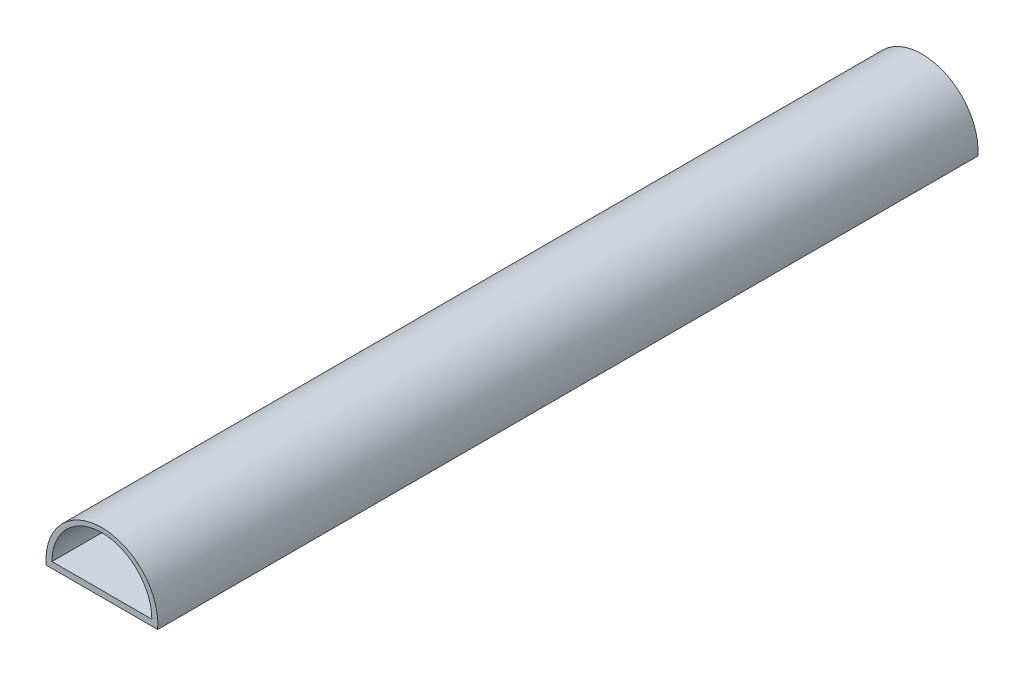
ISO-10303-21;
HEADER;
FILE_DESCRIPTION(('STEP AP214'),'2;1');
FILE_NAME('part.step','',(''),(''),'','','');
FILE_SCHEMA(('AUTOMOTIVE_DESIGN { 1 0 10303 214 1 1 1 1 }'));
ENDSEC;
DATA;
#1=APPLICATION_CONTEXT('core data for automotive mechanical design processes');
#2=APPLICATION_PROTOCOL_DEFINITION('international standard','automotive_design',2000,#1);
#3=PRODUCT_CONTEXT('',#1,'mechanical');
#4=PRODUCT('Part','Part','',(#3));
#5=PRODUCT_RELATED_PRODUCT_CATEGORY('part','',(#4));
#6=PRODUCT_DEFINITION_FORMATION('','',#4);
#7=PRODUCT_DEFINITION_CONTEXT('part definition',#1,'design');
#8=PRODUCT_DEFINITION('design','',#6,#7);
#9=PRODUCT_DEFINITION_SHAPE('','',#8);
#10=(LENGTH_UNIT() NAMED_UNIT(*) SI_UNIT(.MILLI.,.METRE.));
#11=(NAMED_UNIT(*) PLANE_ANGLE_UNIT() SI_UNIT($,.RADIAN.));
#12=(NAMED_UNIT(*) SI_UNIT($,.STERADIAN.) SOLID_ANGLE_UNIT());
#13=UNCERTAINTY_MEASURE_WITH_UNIT(LENGTH_MEASURE(1.E-05),#10,'distance_accuracy_value','');
#14=(GEOMETRIC_REPRESENTATION_CONTEXT(3) GLOBAL_UNCERTAINTY_ASSIGNED_CONTEXT((#13)) GLOBAL_UNIT_ASSIGNED_CONTEXT((#10,
#11,#12)) REPRESENTATION_CONTEXT('',''));
#15=CARTESIAN_POINT('',(0.,0.,0.));
#16=DIRECTION('',(0.,0.,1.));
#17=DIRECTION('',(1.,0.,0.));
#18=AXIS2_PLACEMENT_3D('',#15,#16,#17);
#19=CARTESIAN_POINT('',(-8.42700279293845,-8.87685553456328,215.9));
#20=DIRECTION('',(0.,0.,-1.));
#21=DIRECTION('',(-1.,0.,0.));
#22=AXIS2_PLACEMENT_3D('',#19,#20,#21);
#23=PLANE('',#22);
#24=CARTESIAN_POINT('',(-8.42700279293845,-8.87685553456328,215.9));
#25=DIRECTION('',(0.,0.,1.));
#26=DIRECTION('',(-1.,0.,0.));
#27=AXIS2_PLACEMENT_3D('',#24,#25,#26);
#28=CIRCLE('',#27,14.7310367744908);
#29=CARTESIAN_POINT('',(6.25737220706155,-10.0484251273645,215.9));
#30=VERTEX_POINT('',#29);
#31=CARTESIAN_POINT('',(-23.1113777929385,-10.0484251273645,215.9));
#32=VERTEX_POINT('',#31);
#33=EDGE_CURVE('E103',#30,#32,#28,.T.);
#34=ORIENTED_EDGE('',*,*,#33,.T.);
#35=DIRECTION('',(1.,0.,0.));
#36=VECTOR('',#35,1.);
#37=CARTESIAN_POINT('',(-23.1113777929385,-10.0484251273645,215.9));
#38=LINE('',#37,#36);
#39=EDGE_CURVE('E107',#32,#30,#38,.T.);
#40=ORIENTED_EDGE('',*,*,#39,.T.);
#41=EDGE_LOOP('',(#34,#40));
#42=FACE_BOUND('',#41,.T.);
#43=CARTESIAN_POINT('',(-8.42700279293845,-8.46092512736455,215.9));
#44=DIRECTION('',(0.,0.,1.));
#45=DIRECTION('',(-1.,0.,0.));
#46=AXIS2_PLACEMENT_3D('',#43,#44,#45);
#47=CIRCLE('',#46,13.1445);
#48=CARTESIAN_POINT('',(4.71749720706154,-8.46092512736455,215.9));
#49=VERTEX_POINT('',#48);
#50=CARTESIAN_POINT('',(-21.5715027929384,-8.46092512736455,215.9));
#51=VERTEX_POINT('',#50);
#52=EDGE_CURVE('E83',#49,#51,#47,.T.);
#53=ORIENTED_EDGE('',*,*,#52,.F.);
#54=DIRECTION('',(1.,0.,0.));
#55=VECTOR('',#54,1.);
#56=CARTESIAN_POINT('',(-8.42700279293845,-8.46092512736455,215.9));
#57=LINE('',#56,#55);
#58=EDGE_CURVE('E78',#51,#49,#57,.T.);
#59=ORIENTED_EDGE('',*,*,#58,.F.);
#60=EDGE_LOOP('',(#53,#59));
#61=FACE_BOUND('',#60,.T.);
#62=ADVANCED_FACE('F39',(#42,#61),#23,.F.);
#63=CARTESIAN_POINT('',(-8.42700279293845,-8.87685553456328,0.));
#64=DIRECTION('',(0.,0.,-1.));
#65=DIRECTION('',(-1.,0.,0.));
#66=AXIS2_PLACEMENT_3D('',#63,#64,#65);
#67=PLANE('',#66);
#68=CARTESIAN_POINT('',(-8.42700279293845,-8.87685553456328,0.));
#69=DIRECTION('',(0.,0.,1.));
#70=DIRECTION('',(-1.,0.,0.));
#71=AXIS2_PLACEMENT_3D('',#68,#69,#70);
#72=CIRCLE('',#71,14.7310367744908);
#73=CARTESIAN_POINT('',(6.25737220706155,-10.0484251273645,0.));
#74=VERTEX_POINT('',#73);
#75=CARTESIAN_POINT('',(-23.1113777929385,-10.0484251273645,0.));
#76=VERTEX_POINT('',#75);
#77=EDGE_CURVE('E92',#74,#76,#72,.T.);
#78=ORIENTED_EDGE('',*,*,#77,.F.);
#79=DIRECTION('',(1.,0.,0.));
#80=VECTOR('',#79,1.);
#81=CARTESIAN_POINT('',(-23.1113777929385,-10.0484251273645,0.));
#82=LINE('',#81,#80);
#83=EDGE_CURVE('E108',#76,#74,#82,.T.);
#84=ORIENTED_EDGE('',*,*,#83,.F.);
#85=EDGE_LOOP('',(#78,#84));
#86=FACE_BOUND('',#85,.T.);
#87=DIRECTION('',(1.,0.,0.));
#88=VECTOR('',#87,1.);
#89=CARTESIAN_POINT('',(-8.42700279293845,-8.46092512736455,0.));
#90=LINE('',#89,#88);
#91=CARTESIAN_POINT('',(-21.5715027929384,-8.46092512736455,0.));
#92=VERTEX_POINT('',#91);
#93=CARTESIAN_POINT('',(4.71749720706154,-8.46092512736455,0.));
#94=VERTEX_POINT('',#93);
#95=EDGE_CURVE('E84',#92,#94,#90,.T.);
#96=ORIENTED_EDGE('',*,*,#95,.T.);
#97=CARTESIAN_POINT('',(-8.42700279293845,-8.46092512736455,0.));
#98=DIRECTION('',(0.,0.,1.));
#99=DIRECTION('',(-1.,0.,0.));
#100=AXIS2_PLACEMENT_3D('',#97,#98,#99);
#101=CIRCLE('',#100,13.1445);
#102=EDGE_CURVE('E89',#94,#92,#101,.T.);
#103=ORIENTED_EDGE('',*,*,#102,.T.);
#104=EDGE_LOOP('',(#96,#103));
#105=FACE_BOUND('',#104,.T.);
#106=ADVANCED_FACE('F124',(#86,#105),#67,.T.);
#107=CARTESIAN_POINT('',(-8.42700279293845,-8.87685553456328,215.9));
#108=DIRECTION('',(0.,0.,-1.));
#109=DIRECTION('',(-1.,0.,0.));
#110=AXIS2_PLACEMENT_3D('',#107,#108,#109);
#111=CYLINDRICAL_SURFACE('',#110,14.7310367744908);
#112=ORIENTED_EDGE('',*,*,#77,.T.);
#113=DIRECTION('',(0.,0.,-1.));
#114=VECTOR('',#113,1.);
#115=CARTESIAN_POINT('',(-23.1113777929385,-10.0484251273645,215.9));
#116=LINE('',#115,#114);
#117=EDGE_CURVE('E11',#32,#76,#116,.T.);
#118=ORIENTED_EDGE('',*,*,#117,.F.);
#119=ORIENTED_EDGE('',*,*,#33,.F.);
#120=DIRECTION('',(0.,0.,-1.));
#121=VECTOR('',#120,1.);
#122=CARTESIAN_POINT('',(6.25737220706155,-10.0484251273645,215.9));
#123=LINE('',#122,#121);
#124=EDGE_CURVE('E48',#30,#74,#123,.T.);
#125=ORIENTED_EDGE('',*,*,#124,.T.);
#126=EDGE_LOOP('',(#112,#118,#119,#125));
#127=FACE_BOUND('',#126,.T.);
#128=ADVANCED_FACE('F41',(#127),#111,.T.);
#129=CARTESIAN_POINT('',(-23.1113777929385,-10.0484251273645,215.9));
#130=DIRECTION('',(0.,1.,0.));
#131=DIRECTION('',(0.,0.,1.));
#132=AXIS2_PLACEMENT_3D('',#129,#130,#131);
#133=PLANE('',#132);
#134=ORIENTED_EDGE('',*,*,#83,.T.);
#135=ORIENTED_EDGE('',*,*,#124,.F.);
#136=ORIENTED_EDGE('',*,*,#39,.F.);
#137=ORIENTED_EDGE('',*,*,#117,.T.);
#138=EDGE_LOOP('',(#134,#135,#136,#137));
#139=FACE_BOUND('',#138,.T.);
#140=ADVANCED_FACE('F126',(#139),#133,.F.);
#141=CARTESIAN_POINT('',(-8.42700279293845,-8.46092512736455,215.9));
#142=DIRECTION('',(0.,0.,-1.));
#143=DIRECTION('',(-1.,0.,0.));
#144=AXIS2_PLACEMENT_3D('',#141,#142,#143);
#145=CYLINDRICAL_SURFACE('',#144,13.1445);
#146=ORIENTED_EDGE('',*,*,#102,.F.);
#147=DIRECTION('',(0.,0.,-1.));
#148=VECTOR('',#147,1.);
#149=CARTESIAN_POINT('',(4.71749720706154,-8.46092512736455,215.9));
#150=LINE('',#149,#148);
#151=EDGE_CURVE('E60',#49,#94,#150,.T.);
#152=ORIENTED_EDGE('',*,*,#151,.F.);
#153=ORIENTED_EDGE('',*,*,#52,.T.);
#154=DIRECTION('',(0.,0.,-1.));
#155=VECTOR('',#154,1.);
#156=CARTESIAN_POINT('',(-21.5715027929384,-8.46092512736455,215.9));
#157=LINE('',#156,#155);
#158=EDGE_CURVE('E55',#51,#92,#157,.T.);
#159=ORIENTED_EDGE('',*,*,#158,.T.);
#160=EDGE_LOOP('',(#146,#152,#153,#159));
#161=FACE_BOUND('',#160,.T.);
#162=ADVANCED_FACE('F87',(#161),#145,.F.);
#163=CARTESIAN_POINT('',(-8.42700279293845,-8.46092512736455,215.9));
#164=DIRECTION('',(0.,1.,0.));
#165=DIRECTION('',(-1.,0.,0.));
#166=AXIS2_PLACEMENT_3D('',#163,#164,#165);
#167=PLANE('',#166);
#168=ORIENTED_EDGE('',*,*,#95,.F.);
#169=ORIENTED_EDGE('',*,*,#158,.F.);
#170=ORIENTED_EDGE('',*,*,#58,.T.);
#171=ORIENTED_EDGE('',*,*,#151,.T.);
#172=EDGE_LOOP('',(#168,#169,#170,#171));
#173=FACE_BOUND('',#172,.T.);
#174=ADVANCED_FACE('F79',(#173),#167,.T.);
#175=CLOSED_SHELL('',(#62,#106,#128,#140,#162,#174));
#176=MANIFOLD_SOLID_BREP('B2',#175);
#177=ADVANCED_BREP_SHAPE_REPRESENTATION('',(#18,#176),#14);
#178=SHAPE_DEFINITION_REPRESENTATION(#9,#177);
ENDSEC;
END-ISO-10303-21;
